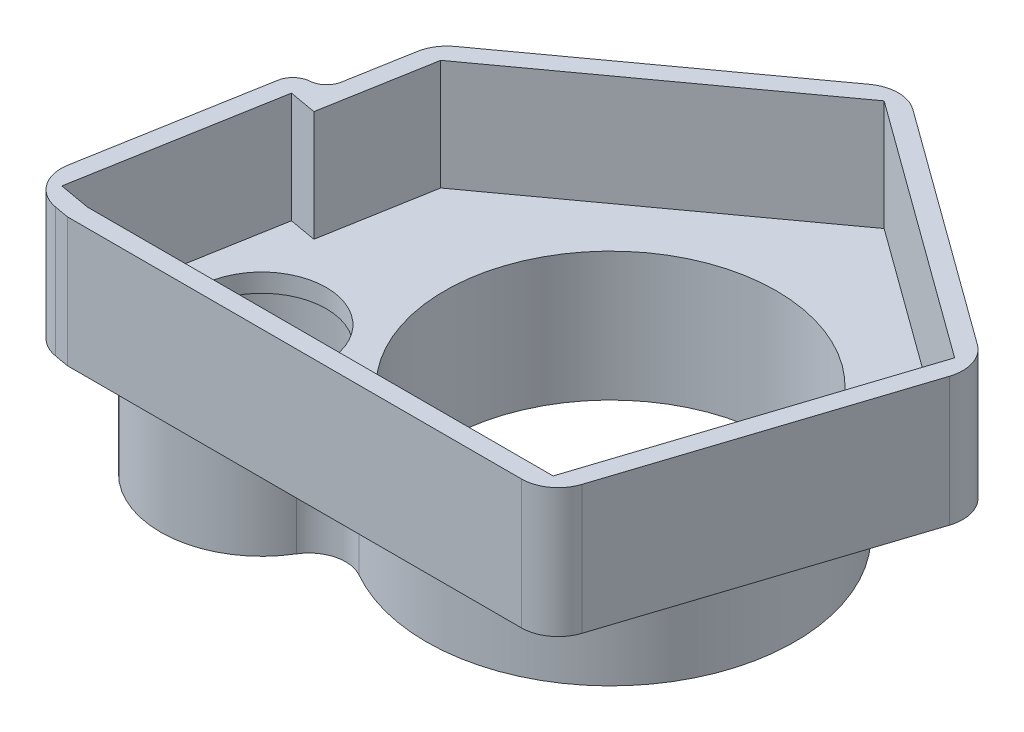
ISO-10303-21;
HEADER;
FILE_DESCRIPTION(('STEP AP214'),'2;1');
FILE_NAME('part.step','',(''),(''),'','','');
FILE_SCHEMA(('AUTOMOTIVE_DESIGN { 1 0 10303 214 1 1 1 1 }'));
ENDSEC;
DATA;
#1=APPLICATION_CONTEXT('core data for automotive mechanical design processes');
#2=APPLICATION_PROTOCOL_DEFINITION('international standard','automotive_design',2000,#1);
#3=PRODUCT_CONTEXT('',#1,'mechanical');
#4=PRODUCT('Part','Part','',(#3));
#5=PRODUCT_RELATED_PRODUCT_CATEGORY('part','',(#4));
#6=PRODUCT_DEFINITION_FORMATION('','',#4);
#7=PRODUCT_DEFINITION_CONTEXT('part definition',#1,'design');
#8=PRODUCT_DEFINITION('design','',#6,#7);
#9=PRODUCT_DEFINITION_SHAPE('','',#8);
#10=(LENGTH_UNIT() NAMED_UNIT(*) SI_UNIT(.MILLI.,.METRE.));
#11=(NAMED_UNIT(*) PLANE_ANGLE_UNIT() SI_UNIT($,.RADIAN.));
#12=(NAMED_UNIT(*) SI_UNIT($,.STERADIAN.) SOLID_ANGLE_UNIT());
#13=UNCERTAINTY_MEASURE_WITH_UNIT(LENGTH_MEASURE(1.E-05),#10,'distance_accuracy_value','');
#14=(GEOMETRIC_REPRESENTATION_CONTEXT(3) GLOBAL_UNCERTAINTY_ASSIGNED_CONTEXT((#13)) GLOBAL_UNIT_ASSIGNED_CONTEXT((#10,
#11,#12)) REPRESENTATION_CONTEXT('',''));
#15=CARTESIAN_POINT('',(0.,0.,0.));
#16=DIRECTION('',(0.,0.,1.));
#17=DIRECTION('',(1.,0.,0.));
#18=AXIS2_PLACEMENT_3D('',#15,#16,#17);
#19=CARTESIAN_POINT('',(0.,35.,-127.603100659897));
#20=DIRECTION('',(0.,-1.,0.));
#21=DIRECTION('',(0.,0.,-1.));
#22=AXIS2_PLACEMENT_3D('',#19,#20,#21);
#23=CYLINDRICAL_SURFACE('',#22,45.);
#24=CARTESIAN_POINT('',(0.,5.,-127.603100659897));
#25=DIRECTION('',(0.,1.,0.));
#26=DIRECTION('',(0.,0.,1.));
#27=AXIS2_PLACEMENT_3D('',#24,#25,#26);
#28=CIRCLE('',#27,45.);
#29=CARTESIAN_POINT('',(0.,5.,-82.6031006598971));
#30=VERTEX_POINT('',#29);
#31=EDGE_CURVE('E320',#30,#30,#28,.T.);
#32=ORIENTED_EDGE('',*,*,#31,.T.);
#33=EDGE_LOOP('',(#32));
#34=FACE_BOUND('',#33,.T.);
#35=CARTESIAN_POINT('',(0.,-30.,-127.603100659897));
#36=DIRECTION('',(0.,-1.,0.));
#37=DIRECTION('',(0.,0.,-1.));
#38=AXIS2_PLACEMENT_3D('',#35,#36,#37);
#39=CIRCLE('',#38,45.);
#40=CARTESIAN_POINT('',(0.,-30.,-172.603100659897));
#41=VERTEX_POINT('',#40);
#42=EDGE_CURVE('E951',#41,#41,#39,.T.);
#43=ORIENTED_EDGE('',*,*,#42,.T.);
#44=EDGE_LOOP('',(#43));
#45=FACE_BOUND('',#44,.T.);
#46=ADVANCED_FACE('F45',(#34,#45),#23,.F.);
#47=CARTESIAN_POINT('',(0.,35.,0.));
#48=DIRECTION('',(0.,-1.,0.));
#49=DIRECTION('',(0.,0.,-1.));
#50=AXIS2_PLACEMENT_3D('',#47,#48,#49);
#51=PLANE('',#50);
#52=DIRECTION('',(-0.809016994374946,0.,-0.587785252292476));
#53=VECTOR('',#52,1.);
#54=CARTESIAN_POINT('',(69.9420150264553,35.,-151.023320226287));
#55=LINE('',#54,#53);
#56=CARTESIAN_POINT('',(69.9420150264553,35.,-151.023320226287));
#57=VERTEX_POINT('',#56);
#58=CARTESIAN_POINT('',(0.,35.,-201.839168637397));
#59=VERTEX_POINT('',#58);
#60=EDGE_CURVE('E251',#57,#59,#55,.T.);
#61=ORIENTED_EDGE('',*,*,#60,.F.);
#62=DIRECTION('',(0.309016994374946,0.,-0.951056516295154));
#63=VECTOR('',#62,1.);
#64=CARTESIAN_POINT('',(43.2265425280054,35.,-68.8015503299486));
#65=LINE('',#64,#63);
#66=CARTESIAN_POINT('',(43.2265425280054,35.,-68.8015503299486));
#67=VERTEX_POINT('',#66);
#68=EDGE_CURVE('E247',#67,#57,#65,.T.);
#69=ORIENTED_EDGE('',*,*,#68,.F.);
#70=DIRECTION('',(1.,0.,0.));
#71=VECTOR('',#70,1.);
#72=CARTESIAN_POINT('',(-83.1081717255187,35.,-68.8015503299486));
#73=LINE('',#72,#71);
#74=CARTESIAN_POINT('',(-83.1081717255187,35.,-68.8015503299486));
#75=VERTEX_POINT('',#74);
#76=EDGE_CURVE('E262',#75,#67,#73,.T.);
#77=ORIENTED_EDGE('',*,*,#76,.F.);
#78=DIRECTION('',(0.984807753012207,0.,0.173648177666935));
#79=VECTOR('',#78,1.);
#80=CARTESIAN_POINT('',(-91.5651971402635,35.,-70.2927520871053));
#81=LINE('',#80,#79);
#82=CARTESIAN_POINT('',(-91.5651971402635,35.,-70.2927520871053));
#83=VERTEX_POINT('',#82);
#84=EDGE_CURVE('E310',#83,#75,#81,.T.);
#85=ORIENTED_EDGE('',*,*,#84,.F.);
#86=DIRECTION('',(-0.173648177666935,0.,0.984807753012207));
#87=VECTOR('',#86,1.);
#88=CARTESIAN_POINT('',(-82.2252247687976,35.,-123.26236759313));
#89=LINE('',#88,#87);
#90=CARTESIAN_POINT('',(-82.2252247687976,35.,-123.26236759313));
#91=VERTEX_POINT('',#90);
#92=EDGE_CURVE('E306',#91,#83,#89,.T.);
#93=ORIENTED_EDGE('',*,*,#92,.F.);
#94=DIRECTION('',(-0.984807753012207,0.,-0.173648177666935));
#95=VECTOR('',#94,1.);
#96=CARTESIAN_POINT('',(-74.8391666212061,35.,-121.960006260628));
#97=LINE('',#96,#95);
#98=CARTESIAN_POINT('',(-74.8391666212061,35.,-121.960006260628));
#99=VERTEX_POINT('',#98);
#100=EDGE_CURVE('E302',#99,#91,#97,.T.);
#101=ORIENTED_EDGE('',*,*,#100,.F.);
#102=DIRECTION('',(-0.173648177666935,0.,0.984807753012207));
#103=VECTOR('',#102,1.);
#104=CARTESIAN_POINT('',(-69.6810938570366,35.,-151.212890552326));
#105=LINE('',#104,#103);
#106=CARTESIAN_POINT('',(-69.6810938570366,35.,-151.212890552326));
#107=VERTEX_POINT('',#106);
#108=EDGE_CURVE('E298',#107,#99,#105,.T.);
#109=ORIENTED_EDGE('',*,*,#108,.F.);
#110=DIRECTION('',(-0.809016994374945,0.,0.587785252292476));
#111=VECTOR('',#110,1.);
#112=CARTESIAN_POINT('',(0.,35.,-201.839168637397));
#113=LINE('',#112,#111);
#114=EDGE_CURVE('E294',#59,#107,#113,.T.);
#115=ORIENTED_EDGE('',*,*,#114,.F.);
#116=EDGE_LOOP('',(#61,#69,#77,#85,#93,#101,#109,#115));
#117=FACE_BOUND('',#116,.T.);
#118=CARTESIAN_POINT('',(-82.9507623746588,35.,-133.544565567419));
#119=DIRECTION('',(0.,-1.,0.));
#120=DIRECTION('',(0.,0.,-1.));
#121=AXIS2_PLACEMENT_3D('',#118,#119,#120);
#122=CIRCLE('',#121,5.);
#123=CARTESIAN_POINT('',(-78.0267236095978,35.,-132.676324679084));
#124=VERTEX_POINT('',#123);
#125=CARTESIAN_POINT('',(-82.5604233086477,35.,-128.559825312045));
#126=VERTEX_POINT('',#125);
#127=EDGE_CURVE('E483',#124,#126,#122,.T.);
#128=ORIENTED_EDGE('',*,*,#127,.T.);
#129=CARTESIAN_POINT('',(-82.1700842426365,35.,-123.575085056671));
#130=DIRECTION('',(0.,-1.,0.));
#131=DIRECTION('',(0.,0.,-1.));
#132=AXIS2_PLACEMENT_3D('',#129,#130,#131);
#133=CIRCLE('',#132,5.);
#134=CARTESIAN_POINT('',(-87.0941230076976,35.,-124.443325945006));
#135=VERTEX_POINT('',#134);
#136=EDGE_CURVE('E11',#126,#135,#133,.F.);
#137=ORIENTED_EDGE('',*,*,#136,.T.);
#138=DIRECTION('',(-0.173648177666935,0.,0.984807753012207));
#139=VECTOR('',#138,1.);
#140=CARTESIAN_POINT('',(-97.3574767936592,35.,-66.236954210379));
#141=LINE('',#140,#139);
#142=CARTESIAN_POINT('',(-95.6209950169898,35.,-76.085031740501));
#143=VERTEX_POINT('',#142);
#144=EDGE_CURVE('E366',#135,#143,#141,.T.);
#145=ORIENTED_EDGE('',*,*,#144,.T.);
#146=CARTESIAN_POINT('',(-85.7729174868677,35.,-74.3485499638317));
#147=DIRECTION('',(0.,-1.,0.));
#148=DIRECTION('',(0.,0.,-1.));
#149=AXIS2_PLACEMENT_3D('',#146,#147,#148);
#150=CIRCLE('',#149,10.);
#151=CARTESIAN_POINT('',(-87.5093992635371,35.,-64.5004724337096));
#152=VERTEX_POINT('',#151);
#153=EDGE_CURVE('E445',#143,#152,#150,.F.);
#154=ORIENTED_EDGE('',*,*,#153,.T.);
#155=DIRECTION('',(0.984807753012207,0.,0.173648177666935));
#156=VECTOR('',#155,1.);
#157=CARTESIAN_POINT('',(-83.5456150431482,35.,-63.8015503299486));
#158=LINE('',#157,#156);
#159=CARTESIAN_POINT('',(-83.5456150431482,35.,-63.8015503299486));
#160=VERTEX_POINT('',#159);
#161=EDGE_CURVE('E342',#152,#160,#158,.T.);
#162=ORIENTED_EDGE('',*,*,#161,.T.);
#163=DIRECTION('',(1.,0.,0.));
#164=VECTOR('',#163,1.);
#165=CARTESIAN_POINT('',(46.8592551680322,35.,-63.8015503299486));
#166=LINE('',#165,#164);
#167=CARTESIAN_POINT('',(39.5938298879785,35.,-63.8015503299486));
#168=VERTEX_POINT('',#167);
#169=EDGE_CURVE('E345',#160,#168,#166,.T.);
#170=ORIENTED_EDGE('',*,*,#169,.T.);
#171=CARTESIAN_POINT('',(39.5938298879785,35.,-73.8015503299486));
#172=DIRECTION('',(0.,-1.,0.));
#173=DIRECTION('',(0.,0.,-1.));
#174=AXIS2_PLACEMENT_3D('',#171,#172,#173);
#175=CIRCLE('',#174,10.);
#176=CARTESIAN_POINT('',(49.1043950509301,35.,-70.7113803861991));
#177=VERTEX_POINT('',#176);
#178=EDGE_CURVE('E448',#168,#177,#175,.F.);
#179=ORIENTED_EDGE('',*,*,#178,.T.);
#180=DIRECTION('',(0.309016994374946,0.,-0.951056516295154));
#181=VECTOR('',#180,1.);
#182=CARTESIAN_POINT('',(75.81986754938,35.,-152.933150282537));
#183=LINE('',#182,#181);
#184=CARTESIAN_POINT('',(73.5747276664821,35.,-146.023320226287));
#185=VERTEX_POINT('',#184);
#186=EDGE_CURVE('E350',#177,#185,#183,.T.);
#187=ORIENTED_EDGE('',*,*,#186,.T.);
#188=CARTESIAN_POINT('',(64.0641625035306,35.,-149.113490170036));
#189=DIRECTION('',(0.,-1.,0.));
#190=DIRECTION('',(0.,0.,-1.));
#191=AXIS2_PLACEMENT_3D('',#188,#189,#190);
#192=CIRCLE('',#191,10.);
#193=CARTESIAN_POINT('',(69.9420150264553,35.,-157.203660113786));
#194=VERTEX_POINT('',#193);
#195=EDGE_CURVE('E436',#185,#194,#192,.F.);
#196=ORIENTED_EDGE('',*,*,#195,.T.);
#197=DIRECTION('',(-0.809016994374946,0.,-0.587785252292476));
#198=VECTOR('',#197,1.);
#199=CARTESIAN_POINT('',(0.,35.,-208.019508524896));
#200=LINE('',#199,#198);
#201=CARTESIAN_POINT('',(5.87785252292478,35.,-203.748998693647));
#202=VERTEX_POINT('',#201);
#203=EDGE_CURVE('E354',#194,#202,#200,.T.);
#204=ORIENTED_EDGE('',*,*,#203,.T.);
#205=CARTESIAN_POINT('',(0.,35.,-195.658828749898));
#206=DIRECTION('',(0.,-1.,0.));
#207=DIRECTION('',(0.,0.,-1.));
#208=AXIS2_PLACEMENT_3D('',#205,#206,#207);
#209=CIRCLE('',#208,10.);
#210=CARTESIAN_POINT('',(-5.87785252292472,35.,-203.748998693647));
#211=VERTEX_POINT('',#210);
#212=EDGE_CURVE('E439',#202,#211,#209,.F.);
#213=ORIENTED_EDGE('',*,*,#212,.T.);
#214=DIRECTION('',(-0.809016994374946,0.,0.587785252292476));
#215=VECTOR('',#214,1.);
#216=CARTESIAN_POINT('',(-74.254340532868,35.,-154.070572238775));
#217=LINE('',#216,#215);
#218=CARTESIAN_POINT('',(-70.98569970413,35.,-156.445378809628));
#219=VERTEX_POINT('',#218);
#220=EDGE_CURVE('E358',#211,#219,#217,.T.);
#221=ORIENTED_EDGE('',*,*,#220,.T.);
#222=CARTESIAN_POINT('',(-65.1078471812052,35.,-148.355208865878));
#223=DIRECTION('',(0.,-1.,0.));
#224=DIRECTION('',(0.,0.,-1.));
#225=AXIS2_PLACEMENT_3D('',#222,#223,#224);
#226=CIRCLE('',#225,10.);
#227=CARTESIAN_POINT('',(-74.9559247113273,35.,-150.091690642547));
#228=VERTEX_POINT('',#227);
#229=EDGE_CURVE('E442',#219,#228,#226,.F.);
#230=ORIENTED_EDGE('',*,*,#229,.T.);
#231=DIRECTION('',(-0.173648177666935,0.,0.984807753012207));
#232=VECTOR('',#231,1.);
#233=CARTESIAN_POINT('',(-78.8949644979324,35.,-127.752285914023));
#234=LINE('',#233,#232);
#235=EDGE_CURVE('E362',#228,#124,#234,.T.);
#236=ORIENTED_EDGE('',*,*,#235,.T.);
#237=EDGE_LOOP('',(#128,#137,#145,#154,#162,#170,#179,#187,#196,#204,#213,#221,#230,#236));
#238=FACE_BOUND('',#237,.T.);
#239=ADVANCED_FACE('F508',(#117,#238),#51,.F.);
#240=CARTESIAN_POINT('',(0.,0.,0.));
#241=DIRECTION('',(0.,-1.,0.));
#242=DIRECTION('',(0.,0.,-1.));
#243=AXIS2_PLACEMENT_3D('',#240,#241,#242);
#244=PLANE('',#243);
#245=CARTESIAN_POINT('',(-61.8532276610313,0.,-94.8284423411193));
#246=DIRECTION('',(0.,-1.,0.));
#247=DIRECTION('',(0.,0.,-1.));
#248=AXIS2_PLACEMENT_3D('',#245,#246,#247);
#249=CIRCLE('',#248,27.5);
#250=CARTESIAN_POINT('',(-38.2941352912617,0.,-80.6432681542204));
#251=VERTEX_POINT('',#250);
#252=CARTESIAN_POINT('',(-60.3607109024427,0.,-122.287910539271));
#253=VERTEX_POINT('',#252);
#254=EDGE_CURVE('E964',#251,#253,#249,.T.);
#255=ORIENTED_EDGE('',*,*,#254,.F.);
#256=CARTESIAN_POINT('',(-29.7271926113455,0.,-75.4850229953481));
#257=DIRECTION('',(0.,1.,0.));
#258=DIRECTION('',(0.,0.,1.));
#259=AXIS2_PLACEMENT_3D('',#256,#257,#258);
#260=CIRCLE('',#259,10.);
#261=CARTESIAN_POINT('',(-24.7726605094545,0.,-84.1713692727729));
#262=VERTEX_POINT('',#261);
#263=EDGE_CURVE('E244',#262,#251,#260,.T.);
#264=ORIENTED_EDGE('',*,*,#263,.F.);
#265=CARTESIAN_POINT('',(0.,0.,-127.603100659897));
#266=DIRECTION('',(0.,-1.,0.));
#267=DIRECTION('',(0.,0.,-1.));
#268=AXIS2_PLACEMENT_3D('',#265,#266,#267);
#269=CIRCLE('',#268,50.);
#270=CARTESIAN_POINT('',(-49.8483146130694,0.,-131.494826528513));
#271=VERTEX_POINT('',#270);
#272=EDGE_CURVE('E240',#271,#262,#269,.T.);
#273=ORIENTED_EDGE('',*,*,#272,.F.);
#274=CARTESIAN_POINT('',(-59.8179775356833,0.,-132.273171702236));
#275=DIRECTION('',(0.,1.,0.));
#276=DIRECTION('',(0.,0.,-1.));
#277=AXIS2_PLACEMENT_3D('',#274,#275,#276);
#278=CIRCLE('',#277,10.);
#279=EDGE_CURVE('E967',#253,#271,#278,.T.);
#280=ORIENTED_EDGE('',*,*,#279,.F.);
#281=EDGE_LOOP('',(#255,#264,#273,#280));
#282=FACE_BOUND('',#281,.T.);
#283=DIRECTION('',(-0.173648177666935,0.,0.984807753012207));
#284=VECTOR('',#283,1.);
#285=CARTESIAN_POINT('',(-97.3574767936592,0.,-66.236954210379));
#286=LINE('',#285,#284);
#287=CARTESIAN_POINT('',(-87.0941230076976,0.,-124.443325945006));
#288=VERTEX_POINT('',#287);
#289=CARTESIAN_POINT('',(-95.6209950169898,0.,-76.085031740501));
#290=VERTEX_POINT('',#289);
#291=EDGE_CURVE('E346',#288,#290,#286,.T.);
#292=ORIENTED_EDGE('',*,*,#291,.F.);
#293=CARTESIAN_POINT('',(-82.1700842426365,0.,-123.575085056671));
#294=DIRECTION('',(0.,-1.,0.));
#295=DIRECTION('',(0.,0.,-1.));
#296=AXIS2_PLACEMENT_3D('',#293,#294,#295);
#297=CIRCLE('',#296,5.);
#298=CARTESIAN_POINT('',(-82.5604233086477,0.,-128.559825312045));
#299=VERTEX_POINT('',#298);
#300=EDGE_CURVE('E68',#288,#299,#297,.T.);
#301=ORIENTED_EDGE('',*,*,#300,.T.);
#302=CARTESIAN_POINT('',(-82.9507623746588,0.,-133.544565567419));
#303=DIRECTION('',(0.,-1.,0.));
#304=DIRECTION('',(0.,0.,-1.));
#305=AXIS2_PLACEMENT_3D('',#302,#303,#304);
#306=CIRCLE('',#305,5.);
#307=CARTESIAN_POINT('',(-78.0267236095978,0.,-132.676324679084));
#308=VERTEX_POINT('',#307);
#309=EDGE_CURVE('E480',#299,#308,#306,.F.);
#310=ORIENTED_EDGE('',*,*,#309,.T.);
#311=DIRECTION('',(-0.173648177666935,0.,0.984807753012207));
#312=VECTOR('',#311,1.);
#313=CARTESIAN_POINT('',(-78.8949644979324,0.,-127.752285914023));
#314=LINE('',#313,#312);
#315=CARTESIAN_POINT('',(-74.9559247113273,0.,-150.091690642547));
#316=VERTEX_POINT('',#315);
#317=EDGE_CURVE('E389',#316,#308,#314,.T.);
#318=ORIENTED_EDGE('',*,*,#317,.F.);
#319=CARTESIAN_POINT('',(-65.1078471812052,0.,-148.355208865878));
#320=DIRECTION('',(0.,-1.,0.));
#321=DIRECTION('',(0.,0.,-1.));
#322=AXIS2_PLACEMENT_3D('',#319,#320,#321);
#323=CIRCLE('',#322,10.);
#324=CARTESIAN_POINT('',(-70.98569970413,0.,-156.445378809628));
#325=VERTEX_POINT('',#324);
#326=EDGE_CURVE('E423',#316,#325,#323,.T.);
#327=ORIENTED_EDGE('',*,*,#326,.T.);
#328=DIRECTION('',(-0.809016994374946,0.,0.587785252292476));
#329=VECTOR('',#328,1.);
#330=CARTESIAN_POINT('',(-74.254340532868,0.,-154.070572238775));
#331=LINE('',#330,#329);
#332=CARTESIAN_POINT('',(-5.87785252292472,0.,-203.748998693647));
#333=VERTEX_POINT('',#332);
#334=EDGE_CURVE('E385',#333,#325,#331,.T.);
#335=ORIENTED_EDGE('',*,*,#334,.F.);
#336=CARTESIAN_POINT('',(0.,0.,-195.658828749898));
#337=DIRECTION('',(0.,-1.,0.));
#338=DIRECTION('',(0.,0.,-1.));
#339=AXIS2_PLACEMENT_3D('',#336,#337,#338);
#340=CIRCLE('',#339,10.);
#341=CARTESIAN_POINT('',(5.87785252292478,0.,-203.748998693647));
#342=VERTEX_POINT('',#341);
#343=EDGE_CURVE('E420',#333,#342,#340,.T.);
#344=ORIENTED_EDGE('',*,*,#343,.T.);
#345=DIRECTION('',(-0.809016994374946,0.,-0.587785252292476));
#346=VECTOR('',#345,1.);
#347=CARTESIAN_POINT('',(0.,0.,-208.019508524896));
#348=LINE('',#347,#346);
#349=CARTESIAN_POINT('',(69.9420150264553,0.,-157.203660113786));
#350=VERTEX_POINT('',#349);
#351=EDGE_CURVE('E381',#350,#342,#348,.T.);
#352=ORIENTED_EDGE('',*,*,#351,.F.);
#353=CARTESIAN_POINT('',(64.0641625035306,0.,-149.113490170036));
#354=DIRECTION('',(0.,-1.,0.));
#355=DIRECTION('',(0.,0.,-1.));
#356=AXIS2_PLACEMENT_3D('',#353,#354,#355);
#357=CIRCLE('',#356,10.);
#358=CARTESIAN_POINT('',(73.5747276664821,0.,-146.023320226287));
#359=VERTEX_POINT('',#358);
#360=EDGE_CURVE('E417',#350,#359,#357,.T.);
#361=ORIENTED_EDGE('',*,*,#360,.T.);
#362=DIRECTION('',(0.309016994374946,0.,-0.951056516295154));
#363=VECTOR('',#362,1.);
#364=CARTESIAN_POINT('',(75.81986754938,0.,-152.933150282537));
#365=LINE('',#364,#363);
#366=CARTESIAN_POINT('',(49.1043950509301,0.,-70.7113803861991));
#367=VERTEX_POINT('',#366);
#368=EDGE_CURVE('E377',#367,#359,#365,.T.);
#369=ORIENTED_EDGE('',*,*,#368,.F.);
#370=CARTESIAN_POINT('',(39.5938298879785,0.,-73.8015503299486));
#371=DIRECTION('',(0.,-1.,0.));
#372=DIRECTION('',(0.,0.,-1.));
#373=AXIS2_PLACEMENT_3D('',#370,#371,#372);
#374=CIRCLE('',#373,10.);
#375=CARTESIAN_POINT('',(39.5938298879785,0.,-63.8015503299486));
#376=VERTEX_POINT('',#375);
#377=EDGE_CURVE('E430',#367,#376,#374,.T.);
#378=ORIENTED_EDGE('',*,*,#377,.T.);
#379=DIRECTION('',(1.,0.,0.));
#380=VECTOR('',#379,1.);
#381=CARTESIAN_POINT('',(46.8592551680322,0.,-63.8015503299486));
#382=LINE('',#381,#380);
#383=CARTESIAN_POINT('',(-83.5456150431482,0.,-63.8015503299486));
#384=VERTEX_POINT('',#383);
#385=EDGE_CURVE('E373',#384,#376,#382,.T.);
#386=ORIENTED_EDGE('',*,*,#385,.F.);
#387=DIRECTION('',(0.984807753012207,0.,0.173648177666935));
#388=VECTOR('',#387,1.);
#389=CARTESIAN_POINT('',(-83.5456150431482,0.,-63.8015503299486));
#390=LINE('',#389,#388);
#391=CARTESIAN_POINT('',(-87.5093992635371,0.,-64.5004724337096));
#392=VERTEX_POINT('',#391);
#393=EDGE_CURVE('E370',#392,#384,#390,.T.);
#394=ORIENTED_EDGE('',*,*,#393,.F.);
#395=CARTESIAN_POINT('',(-85.7729174868677,0.,-74.3485499638317));
#396=DIRECTION('',(0.,-1.,0.));
#397=DIRECTION('',(0.,0.,-1.));
#398=AXIS2_PLACEMENT_3D('',#395,#396,#397);
#399=CIRCLE('',#398,10.);
#400=EDGE_CURVE('E426',#392,#290,#399,.T.);
#401=ORIENTED_EDGE('',*,*,#400,.T.);
#402=EDGE_LOOP('',(#292,#301,#310,#318,#327,#335,#344,#352,#361,#369,#378,#386,#394,#401));
#403=FACE_BOUND('',#402,.T.);
#404=ADVANCED_FACE('F498',(#282,#403),#244,.T.);
#405=CARTESIAN_POINT('',(-83.5456150431482,35.,-63.8015503299486));
#406=DIRECTION('',(0.173648177666935,0.,-0.984807753012207));
#407=DIRECTION('',(-0.984807753012207,0.,-0.173648177666935));
#408=AXIS2_PLACEMENT_3D('',#405,#406,#407);
#409=PLANE('',#408);
#410=ORIENTED_EDGE('',*,*,#161,.F.);
#411=DIRECTION('',(0.,-1.,0.));
#412=VECTOR('',#411,1.);
#413=CARTESIAN_POINT('',(-87.5093992635371,35.,-64.5004724337096));
#414=LINE('',#413,#412);
#415=EDGE_CURVE('E451',#152,#392,#414,.T.);
#416=ORIENTED_EDGE('',*,*,#415,.T.);
#417=ORIENTED_EDGE('',*,*,#393,.T.);
#418=DIRECTION('',(0.,-1.,0.));
#419=VECTOR('',#418,1.);
#420=CARTESIAN_POINT('',(-83.5456150431482,35.,-63.8015503299486));
#421=LINE('',#420,#419);
#422=EDGE_CURVE('E369',#160,#384,#421,.T.);
#423=ORIENTED_EDGE('',*,*,#422,.F.);
#424=EDGE_LOOP('',(#410,#416,#417,#423));
#425=FACE_BOUND('',#424,.T.);
#426=ADVANCED_FACE('F512',(#425),#409,.F.);
#427=CARTESIAN_POINT('',(46.8592551680322,35.,-63.8015503299486));
#428=DIRECTION('',(0.,0.,-1.));
#429=DIRECTION('',(-1.,0.,0.));
#430=AXIS2_PLACEMENT_3D('',#427,#428,#429);
#431=PLANE('',#430);
#432=ORIENTED_EDGE('',*,*,#385,.T.);
#433=DIRECTION('',(0.,-1.,0.));
#434=VECTOR('',#433,1.);
#435=CARTESIAN_POINT('',(39.5938298879785,35.,-63.8015503299486));
#436=LINE('',#435,#434);
#437=EDGE_CURVE('E433',#376,#168,#436,.F.);
#438=ORIENTED_EDGE('',*,*,#437,.T.);
#439=ORIENTED_EDGE('',*,*,#169,.F.);
#440=ORIENTED_EDGE('',*,*,#422,.T.);
#441=EDGE_LOOP('',(#432,#438,#439,#440));
#442=FACE_BOUND('',#441,.T.);
#443=ADVANCED_FACE('F514',(#442),#431,.F.);
#444=CARTESIAN_POINT('',(75.81986754938,35.,-152.933150282537));
#445=DIRECTION('',(-0.951056516295154,0.,-0.309016994374946));
#446=DIRECTION('',(-0.309016994374946,0.,0.951056516295154));
#447=AXIS2_PLACEMENT_3D('',#444,#445,#446);
#448=PLANE('',#447);
#449=ORIENTED_EDGE('',*,*,#186,.F.);
#450=DIRECTION('',(0.,-1.,0.));
#451=VECTOR('',#450,1.);
#452=CARTESIAN_POINT('',(49.1043950509301,35.,-70.7113803861991));
#453=LINE('',#452,#451);
#454=EDGE_CURVE('E413',#177,#367,#453,.T.);
#455=ORIENTED_EDGE('',*,*,#454,.T.);
#456=ORIENTED_EDGE('',*,*,#368,.T.);
#457=DIRECTION('',(0.,-1.,0.));
#458=VECTOR('',#457,1.);
#459=CARTESIAN_POINT('',(73.5747276664821,35.,-146.023320226287));
#460=LINE('',#459,#458);
#461=EDGE_CURVE('E405',#359,#185,#460,.F.);
#462=ORIENTED_EDGE('',*,*,#461,.T.);
#463=EDGE_LOOP('',(#449,#455,#456,#462));
#464=FACE_BOUND('',#463,.T.);
#465=ADVANCED_FACE('F523',(#464),#448,.F.);
#466=CARTESIAN_POINT('',(0.,35.,-208.019508524896));
#467=DIRECTION('',(-0.587785252292476,0.,0.809016994374946));
#468=DIRECTION('',(0.809016994374946,0.,0.587785252292476));
#469=AXIS2_PLACEMENT_3D('',#466,#467,#468);
#470=PLANE('',#469);
#471=ORIENTED_EDGE('',*,*,#351,.T.);
#472=DIRECTION('',(0.,-1.,0.));
#473=VECTOR('',#472,1.);
#474=CARTESIAN_POINT('',(5.87785252292478,35.,-203.748998693647));
#475=LINE('',#474,#473);
#476=EDGE_CURVE('E474',#342,#202,#475,.F.);
#477=ORIENTED_EDGE('',*,*,#476,.T.);
#478=ORIENTED_EDGE('',*,*,#203,.F.);
#479=DIRECTION('',(0.,-1.,0.));
#480=VECTOR('',#479,1.);
#481=CARTESIAN_POINT('',(69.9420150264554,35.,-157.203660113786));
#482=LINE('',#481,#480);
#483=EDGE_CURVE('E470',#194,#350,#482,.T.);
#484=ORIENTED_EDGE('',*,*,#483,.T.);
#485=EDGE_LOOP('',(#471,#477,#478,#484));
#486=FACE_BOUND('',#485,.T.);
#487=ADVANCED_FACE('F532',(#486),#470,.F.);
#488=CARTESIAN_POINT('',(-74.254340532868,35.,-154.070572238775));
#489=DIRECTION('',(0.587785252292476,0.,0.809016994374946));
#490=DIRECTION('',(0.809016994374946,0.,-0.587785252292476));
#491=AXIS2_PLACEMENT_3D('',#488,#489,#490);
#492=PLANE('',#491);
#493=ORIENTED_EDGE('',*,*,#334,.T.);
#494=DIRECTION('',(0.,-1.,0.));
#495=VECTOR('',#494,1.);
#496=CARTESIAN_POINT('',(-70.98569970413,35.,-156.445378809628));
#497=LINE('',#496,#495);
#498=EDGE_CURVE('E467',#325,#219,#497,.F.);
#499=ORIENTED_EDGE('',*,*,#498,.T.);
#500=ORIENTED_EDGE('',*,*,#220,.F.);
#501=DIRECTION('',(0.,-1.,0.));
#502=VECTOR('',#501,1.);
#503=CARTESIAN_POINT('',(-5.87785252292471,35.,-203.748998693647));
#504=LINE('',#503,#502);
#505=EDGE_CURVE('E463',#211,#333,#504,.T.);
#506=ORIENTED_EDGE('',*,*,#505,.T.);
#507=EDGE_LOOP('',(#493,#499,#500,#506));
#508=FACE_BOUND('',#507,.T.);
#509=ADVANCED_FACE('F541',(#508),#492,.F.);
#510=CARTESIAN_POINT('',(-78.8949644979324,35.,-127.752285914023));
#511=DIRECTION('',(0.984807753012207,0.,0.173648177666935));
#512=DIRECTION('',(0.173648177666935,0.,-0.984807753012207));
#513=AXIS2_PLACEMENT_3D('',#510,#511,#512);
#514=PLANE('',#513);
#515=ORIENTED_EDGE('',*,*,#317,.T.);
#516=DIRECTION('',(0.,-1.,0.));
#517=VECTOR('',#516,1.);
#518=CARTESIAN_POINT('',(-78.0267236095978,35.,-132.676324679084));
#519=LINE('',#518,#517);
#520=EDGE_CURVE('E477',#308,#124,#519,.F.);
#521=ORIENTED_EDGE('',*,*,#520,.T.);
#522=ORIENTED_EDGE('',*,*,#235,.F.);
#523=DIRECTION('',(0.,-1.,0.));
#524=VECTOR('',#523,1.);
#525=CARTESIAN_POINT('',(-74.9559247113273,35.,-150.091690642547));
#526=LINE('',#525,#524);
#527=EDGE_CURVE('E459',#228,#316,#526,.T.);
#528=ORIENTED_EDGE('',*,*,#527,.T.);
#529=EDGE_LOOP('',(#515,#521,#522,#528));
#530=FACE_BOUND('',#529,.T.);
#531=ADVANCED_FACE('F550',(#530),#514,.F.);
#532=CARTESIAN_POINT('',(-97.3574767936592,35.,-66.236954210379));
#533=DIRECTION('',(0.984807753012207,0.,0.173648177666935));
#534=DIRECTION('',(0.173648177666935,0.,-0.984807753012207));
#535=AXIS2_PLACEMENT_3D('',#532,#533,#534);
#536=PLANE('',#535);
#537=ORIENTED_EDGE('',*,*,#144,.F.);
#538=DIRECTION('',(0.,1.,0.));
#539=VECTOR('',#538,1.);
#540=CARTESIAN_POINT('',(-87.0941230076976,35.,-124.443325945006));
#541=LINE('',#540,#539);
#542=EDGE_CURVE('E486',#135,#288,#541,.F.);
#543=ORIENTED_EDGE('',*,*,#542,.T.);
#544=ORIENTED_EDGE('',*,*,#291,.T.);
#545=DIRECTION('',(0.,-1.,0.));
#546=VECTOR('',#545,1.);
#547=CARTESIAN_POINT('',(-95.6209950169898,35.,-76.085031740501));
#548=LINE('',#547,#546);
#549=EDGE_CURVE('E455',#290,#143,#548,.F.);
#550=ORIENTED_EDGE('',*,*,#549,.T.);
#551=EDGE_LOOP('',(#537,#543,#544,#550));
#552=FACE_BOUND('',#551,.T.);
#553=ADVANCED_FACE('F495',(#552),#536,.F.);
#554=CARTESIAN_POINT('',(43.2265425280054,5.,-68.8015503299486));
#555=DIRECTION('',(0.951056516295154,0.,0.309016994374946));
#556=DIRECTION('',(0.309016994374946,0.,-0.951056516295154));
#557=AXIS2_PLACEMENT_3D('',#554,#555,#556);
#558=PLANE('',#557);
#559=ORIENTED_EDGE('',*,*,#68,.T.);
#560=DIRECTION('',(0.,1.,0.));
#561=VECTOR('',#560,1.);
#562=CARTESIAN_POINT('',(69.9420150264553,5.,-151.023320226287));
#563=LINE('',#562,#561);
#564=CARTESIAN_POINT('',(69.9420150264553,5.,-151.023320226287));
#565=VERTEX_POINT('',#564);
#566=EDGE_CURVE('E289',#565,#57,#563,.T.);
#567=ORIENTED_EDGE('',*,*,#566,.F.);
#568=DIRECTION('',(0.309016994374946,0.,-0.951056516295154));
#569=VECTOR('',#568,1.);
#570=CARTESIAN_POINT('',(43.2265425280054,5.,-68.8015503299486));
#571=LINE('',#570,#569);
#572=CARTESIAN_POINT('',(43.2265425280054,5.,-68.8015503299486));
#573=VERTEX_POINT('',#572);
#574=EDGE_CURVE('E257',#573,#565,#571,.T.);
#575=ORIENTED_EDGE('',*,*,#574,.F.);
#576=DIRECTION('',(0.,1.,0.));
#577=VECTOR('',#576,1.);
#578=CARTESIAN_POINT('',(43.2265425280054,5.,-68.8015503299486));
#579=LINE('',#578,#577);
#580=EDGE_CURVE('E317',#573,#67,#579,.T.);
#581=ORIENTED_EDGE('',*,*,#580,.T.);
#582=EDGE_LOOP('',(#559,#567,#575,#581));
#583=FACE_BOUND('',#582,.T.);
#584=ADVANCED_FACE('F567',(#583),#558,.F.);
#585=CARTESIAN_POINT('',(-83.1081717255187,5.,-68.8015503299486));
#586=DIRECTION('',(0.,0.,1.));
#587=DIRECTION('',(1.,0.,0.));
#588=AXIS2_PLACEMENT_3D('',#585,#586,#587);
#589=PLANE('',#588);
#590=ORIENTED_EDGE('',*,*,#76,.T.);
#591=ORIENTED_EDGE('',*,*,#580,.F.);
#592=DIRECTION('',(1.,0.,0.));
#593=VECTOR('',#592,1.);
#594=CARTESIAN_POINT('',(-83.1081717255187,5.,-68.8015503299486));
#595=LINE('',#594,#593);
#596=CARTESIAN_POINT('',(-83.1081717255187,5.,-68.8015503299486));
#597=VERTEX_POINT('',#596);
#598=EDGE_CURVE('E286',#597,#573,#595,.T.);
#599=ORIENTED_EDGE('',*,*,#598,.F.);
#600=DIRECTION('',(0.,1.,0.));
#601=VECTOR('',#600,1.);
#602=CARTESIAN_POINT('',(-83.1081717255187,5.,-68.8015503299486));
#603=LINE('',#602,#601);
#604=EDGE_CURVE('E321',#597,#75,#603,.T.);
#605=ORIENTED_EDGE('',*,*,#604,.T.);
#606=EDGE_LOOP('',(#590,#591,#599,#605));
#607=FACE_BOUND('',#606,.T.);
#608=ADVANCED_FACE('F788',(#607),#589,.F.);
#609=CARTESIAN_POINT('',(-91.5651971402635,5.,-70.2927520871053));
#610=DIRECTION('',(-0.173648177666935,0.,0.984807753012207));
#611=DIRECTION('',(0.984807753012207,0.,0.173648177666935));
#612=AXIS2_PLACEMENT_3D('',#609,#610,#611);
#613=PLANE('',#612);
#614=ORIENTED_EDGE('',*,*,#84,.T.);
#615=ORIENTED_EDGE('',*,*,#604,.F.);
#616=DIRECTION('',(0.984807753012207,0.,0.173648177666935));
#617=VECTOR('',#616,1.);
#618=CARTESIAN_POINT('',(-91.5651971402635,5.,-70.2927520871053));
#619=LINE('',#618,#617);
#620=CARTESIAN_POINT('',(-91.5651971402635,5.,-70.2927520871053));
#621=VERTEX_POINT('',#620);
#622=EDGE_CURVE('E282',#621,#597,#619,.T.);
#623=ORIENTED_EDGE('',*,*,#622,.F.);
#624=DIRECTION('',(0.,1.,0.));
#625=VECTOR('',#624,1.);
#626=CARTESIAN_POINT('',(-91.5651971402635,5.,-70.2927520871053));
#627=LINE('',#626,#625);
#628=EDGE_CURVE('E324',#621,#83,#627,.T.);
#629=ORIENTED_EDGE('',*,*,#628,.T.);
#630=EDGE_LOOP('',(#614,#615,#623,#629));
#631=FACE_BOUND('',#630,.T.);
#632=ADVANCED_FACE('F778',(#631),#613,.F.);
#633=CARTESIAN_POINT('',(-82.2252247687976,5.,-123.26236759313));
#634=DIRECTION('',(-0.984807753012207,0.,-0.173648177666935));
#635=DIRECTION('',(-0.173648177666935,0.,0.984807753012207));
#636=AXIS2_PLACEMENT_3D('',#633,#634,#635);
#637=PLANE('',#636);
#638=ORIENTED_EDGE('',*,*,#92,.T.);
#639=ORIENTED_EDGE('',*,*,#628,.F.);
#640=DIRECTION('',(-0.173648177666935,0.,0.984807753012207));
#641=VECTOR('',#640,1.);
#642=CARTESIAN_POINT('',(-82.2252247687976,5.,-123.26236759313));
#643=LINE('',#642,#641);
#644=CARTESIAN_POINT('',(-82.2252247687976,5.,-123.26236759313));
#645=VERTEX_POINT('',#644);
#646=EDGE_CURVE('E278',#645,#621,#643,.T.);
#647=ORIENTED_EDGE('',*,*,#646,.F.);
#648=DIRECTION('',(0.,1.,0.));
#649=VECTOR('',#648,1.);
#650=CARTESIAN_POINT('',(-82.2252247687976,5.,-123.26236759313));
#651=LINE('',#650,#649);
#652=EDGE_CURVE('E327',#645,#91,#651,.T.);
#653=ORIENTED_EDGE('',*,*,#652,.T.);
#654=EDGE_LOOP('',(#638,#639,#647,#653));
#655=FACE_BOUND('',#654,.T.);
#656=ADVANCED_FACE('F768',(#655),#637,.F.);
#657=CARTESIAN_POINT('',(-74.8391666212061,5.,-121.960006260628));
#658=DIRECTION('',(0.173648177666935,0.,-0.984807753012207));
#659=DIRECTION('',(-0.984807753012207,0.,-0.173648177666935));
#660=AXIS2_PLACEMENT_3D('',#657,#658,#659);
#661=PLANE('',#660);
#662=ORIENTED_EDGE('',*,*,#100,.T.);
#663=ORIENTED_EDGE('',*,*,#652,.F.);
#664=DIRECTION('',(-0.984807753012207,0.,-0.173648177666935));
#665=VECTOR('',#664,1.);
#666=CARTESIAN_POINT('',(-74.8391666212061,5.,-121.960006260628));
#667=LINE('',#666,#665);
#668=CARTESIAN_POINT('',(-74.8391666212061,5.,-121.960006260628));
#669=VERTEX_POINT('',#668);
#670=EDGE_CURVE('E274',#669,#645,#667,.T.);
#671=ORIENTED_EDGE('',*,*,#670,.F.);
#672=DIRECTION('',(0.,1.,0.));
#673=VECTOR('',#672,1.);
#674=CARTESIAN_POINT('',(-74.8391666212061,5.,-121.960006260628));
#675=LINE('',#674,#673);
#676=EDGE_CURVE('E330',#669,#99,#675,.T.);
#677=ORIENTED_EDGE('',*,*,#676,.T.);
#678=EDGE_LOOP('',(#662,#663,#671,#677));
#679=FACE_BOUND('',#678,.T.);
#680=ADVANCED_FACE('F758',(#679),#661,.F.);
#681=CARTESIAN_POINT('',(-69.6810938570366,5.,-151.212890552326));
#682=DIRECTION('',(-0.984807753012207,0.,-0.173648177666935));
#683=DIRECTION('',(-0.173648177666935,0.,0.984807753012207));
#684=AXIS2_PLACEMENT_3D('',#681,#682,#683);
#685=PLANE('',#684);
#686=ORIENTED_EDGE('',*,*,#108,.T.);
#687=ORIENTED_EDGE('',*,*,#676,.F.);
#688=DIRECTION('',(-0.173648177666935,0.,0.984807753012207));
#689=VECTOR('',#688,1.);
#690=CARTESIAN_POINT('',(-69.6810938570366,5.,-151.212890552326));
#691=LINE('',#690,#689);
#692=CARTESIAN_POINT('',(-69.6810938570366,5.,-151.212890552326));
#693=VERTEX_POINT('',#692);
#694=EDGE_CURVE('E270',#693,#669,#691,.T.);
#695=ORIENTED_EDGE('',*,*,#694,.F.);
#696=DIRECTION('',(0.,1.,0.));
#697=VECTOR('',#696,1.);
#698=CARTESIAN_POINT('',(-69.6810938570366,5.,-151.212890552326));
#699=LINE('',#698,#697);
#700=EDGE_CURVE('E333',#693,#107,#699,.T.);
#701=ORIENTED_EDGE('',*,*,#700,.T.);
#702=EDGE_LOOP('',(#686,#687,#695,#701));
#703=FACE_BOUND('',#702,.T.);
#704=ADVANCED_FACE('F748',(#703),#685,.F.);
#705=CARTESIAN_POINT('',(0.,5.,-201.839168637397));
#706=DIRECTION('',(-0.587785252292476,0.,-0.809016994374946));
#707=DIRECTION('',(-0.809016994374946,0.,0.587785252292476));
#708=AXIS2_PLACEMENT_3D('',#705,#706,#707);
#709=PLANE('',#708);
#710=ORIENTED_EDGE('',*,*,#114,.T.);
#711=ORIENTED_EDGE('',*,*,#700,.F.);
#712=DIRECTION('',(-0.809016994374945,0.,0.587785252292476));
#713=VECTOR('',#712,1.);
#714=CARTESIAN_POINT('',(0.,5.,-201.839168637397));
#715=LINE('',#714,#713);
#716=CARTESIAN_POINT('',(0.,5.,-201.839168637397));
#717=VERTEX_POINT('',#716);
#718=EDGE_CURVE('E266',#717,#693,#715,.T.);
#719=ORIENTED_EDGE('',*,*,#718,.F.);
#720=DIRECTION('',(0.,1.,0.));
#721=VECTOR('',#720,1.);
#722=CARTESIAN_POINT('',(0.,5.,-201.839168637397));
#723=LINE('',#722,#721);
#724=EDGE_CURVE('E336',#717,#59,#723,.T.);
#725=ORIENTED_EDGE('',*,*,#724,.T.);
#726=EDGE_LOOP('',(#710,#711,#719,#725));
#727=FACE_BOUND('',#726,.T.);
#728=ADVANCED_FACE('F739',(#727),#709,.F.);
#729=CARTESIAN_POINT('',(69.9420150264553,5.,-151.023320226287));
#730=DIRECTION('',(0.587785252292476,0.,-0.809016994374946));
#731=DIRECTION('',(-0.809016994374946,0.,-0.587785252292476));
#732=AXIS2_PLACEMENT_3D('',#729,#730,#731);
#733=PLANE('',#732);
#734=ORIENTED_EDGE('',*,*,#60,.T.);
#735=ORIENTED_EDGE('',*,*,#724,.F.);
#736=DIRECTION('',(-0.809016994374946,0.,-0.587785252292476));
#737=VECTOR('',#736,1.);
#738=CARTESIAN_POINT('',(69.9420150264553,5.,-151.023320226287));
#739=LINE('',#738,#737);
#740=EDGE_CURVE('E261',#565,#717,#739,.T.);
#741=ORIENTED_EDGE('',*,*,#740,.F.);
#742=ORIENTED_EDGE('',*,*,#566,.T.);
#743=EDGE_LOOP('',(#734,#735,#741,#742));
#744=FACE_BOUND('',#743,.T.);
#745=ADVANCED_FACE('F730',(#744),#733,.F.);
#746=CARTESIAN_POINT('',(0.,5.,0.));
#747=DIRECTION('',(0.,1.,0.));
#748=DIRECTION('',(0.,0.,1.));
#749=AXIS2_PLACEMENT_3D('',#746,#747,#748);
#750=PLANE('',#749);
#751=CARTESIAN_POINT('',(-61.8532276610313,5.,-94.8284423411193));
#752=DIRECTION('',(0.,1.,0.));
#753=DIRECTION('',(0.,0.,1.));
#754=AXIS2_PLACEMENT_3D('',#751,#752,#753);
#755=CIRCLE('',#754,17.5);
#756=CARTESIAN_POINT('',(-61.8532276610313,5.,-77.3284423411193));
#757=VERTEX_POINT('',#756);
#758=EDGE_CURVE('E410',#757,#757,#755,.T.);
#759=ORIENTED_EDGE('',*,*,#758,.F.);
#760=EDGE_LOOP('',(#759));
#761=FACE_BOUND('',#760,.T.);
#762=ORIENTED_EDGE('',*,*,#31,.F.);
#763=EDGE_LOOP('',(#762));
#764=FACE_BOUND('',#763,.T.);
#765=ORIENTED_EDGE('',*,*,#574,.T.);
#766=ORIENTED_EDGE('',*,*,#740,.T.);
#767=ORIENTED_EDGE('',*,*,#718,.T.);
#768=ORIENTED_EDGE('',*,*,#694,.T.);
#769=ORIENTED_EDGE('',*,*,#670,.T.);
#770=ORIENTED_EDGE('',*,*,#646,.T.);
#771=ORIENTED_EDGE('',*,*,#622,.T.);
#772=ORIENTED_EDGE('',*,*,#598,.T.);
#773=EDGE_LOOP('',(#765,#766,#767,#768,#769,#770,#771,#772));
#774=FACE_BOUND('',#773,.T.);
#775=ADVANCED_FACE('F710',(#761,#764,#774),#750,.T.);
#776=CARTESIAN_POINT('',(-45.7902101361884,-30.,-85.1567326682337));
#777=DIRECTION('',(0.,1.,0.));
#778=DIRECTION('',(0.,0.,1.));
#779=AXIS2_PLACEMENT_3D('',#776,#777,#778);
#780=PLANE('',#779);
#781=CARTESIAN_POINT('',(-29.7271926113455,-30.,-75.4850229953481));
#782=DIRECTION('',(0.,1.,0.));
#783=DIRECTION('',(0.,0.,1.));
#784=AXIS2_PLACEMENT_3D('',#781,#782,#783);
#785=CIRCLE('',#784,10.);
#786=CARTESIAN_POINT('',(-24.7726605094545,-30.,-84.1713692727729));
#787=VERTEX_POINT('',#786);
#788=CARTESIAN_POINT('',(-38.2941352912617,-30.,-80.6432681542204));
#789=VERTEX_POINT('',#788);
#790=EDGE_CURVE('E229',#787,#789,#785,.T.);
#791=ORIENTED_EDGE('',*,*,#790,.T.);
#792=CARTESIAN_POINT('',(-61.8532276610313,-30.,-94.8284423411193));
#793=DIRECTION('',(0.,-1.,0.));
#794=DIRECTION('',(0.,0.,-1.));
#795=AXIS2_PLACEMENT_3D('',#792,#793,#794);
#796=CIRCLE('',#795,27.5);
#797=CARTESIAN_POINT('',(-60.3607109024427,-30.,-122.287910539271));
#798=VERTEX_POINT('',#797);
#799=EDGE_CURVE('E217',#789,#798,#796,.T.);
#800=ORIENTED_EDGE('',*,*,#799,.T.);
#801=CARTESIAN_POINT('',(-59.8179775356833,-30.,-132.273171702236));
#802=DIRECTION('',(0.,1.,0.));
#803=DIRECTION('',(0.,0.,-1.));
#804=AXIS2_PLACEMENT_3D('',#801,#802,#803);
#805=CIRCLE('',#804,10.);
#806=CARTESIAN_POINT('',(-49.8483146130694,-30.,-131.494826528513));
#807=VERTEX_POINT('',#806);
#808=EDGE_CURVE('E228',#798,#807,#805,.T.);
#809=ORIENTED_EDGE('',*,*,#808,.T.);
#810=CARTESIAN_POINT('',(0.,-30.,-127.603100659897));
#811=DIRECTION('',(0.,-1.,0.));
#812=DIRECTION('',(0.,0.,-1.));
#813=AXIS2_PLACEMENT_3D('',#810,#811,#812);
#814=CIRCLE('',#813,50.);
#815=EDGE_CURVE('E235',#807,#787,#814,.T.);
#816=ORIENTED_EDGE('',*,*,#815,.T.);
#817=EDGE_LOOP('',(#791,#800,#809,#816));
#818=FACE_BOUND('',#817,.T.);
#819=ORIENTED_EDGE('',*,*,#42,.F.);
#820=EDGE_LOOP('',(#819));
#821=FACE_BOUND('',#820,.T.);
#822=CARTESIAN_POINT('',(-61.8532276610313,-30.,-94.8284423411193));
#823=DIRECTION('',(0.,-1.,0.));
#824=DIRECTION('',(0.,0.,-1.));
#825=AXIS2_PLACEMENT_3D('',#822,#823,#824);
#826=CIRCLE('',#825,22.5);
#827=CARTESIAN_POINT('',(-61.8532276610313,-30.,-117.328442341119));
#828=VERTEX_POINT('',#827);
#829=EDGE_CURVE('E947',#828,#828,#826,.T.);
#830=ORIENTED_EDGE('',*,*,#829,.F.);
#831=EDGE_LOOP('',(#830));
#832=FACE_BOUND('',#831,.T.);
#833=ADVANCED_FACE('F232',(#818,#821,#832),#780,.F.);
#834=CARTESIAN_POINT('',(-29.7271926113455,-30.,-75.4850229953481));
#835=DIRECTION('',(0.,1.,0.));
#836=DIRECTION('',(0.,0.,1.));
#837=AXIS2_PLACEMENT_3D('',#834,#835,#836);
#838=CYLINDRICAL_SURFACE('',#837,10.);
#839=ORIENTED_EDGE('',*,*,#263,.T.);
#840=DIRECTION('',(0.,1.,0.));
#841=VECTOR('',#840,1.);
#842=CARTESIAN_POINT('',(-38.2941352912617,-30.,-80.6432681542204));
#843=LINE('',#842,#841);
#844=EDGE_CURVE('E221',#789,#251,#843,.T.);
#845=ORIENTED_EDGE('',*,*,#844,.F.);
#846=ORIENTED_EDGE('',*,*,#790,.F.);
#847=DIRECTION('',(0.,1.,0.));
#848=VECTOR('',#847,1.);
#849=CARTESIAN_POINT('',(-24.7726605094545,-30.,-84.1713692727729));
#850=LINE('',#849,#848);
#851=EDGE_CURVE('E961',#787,#262,#850,.T.);
#852=ORIENTED_EDGE('',*,*,#851,.T.);
#853=EDGE_LOOP('',(#839,#845,#846,#852));
#854=FACE_BOUND('',#853,.T.);
#855=ADVANCED_FACE('F242',(#854),#838,.F.);
#856=CARTESIAN_POINT('',(-61.8532276610313,-30.,-94.8284423411193));
#857=DIRECTION('',(0.,1.,0.));
#858=DIRECTION('',(0.,0.,1.));
#859=AXIS2_PLACEMENT_3D('',#856,#857,#858);
#860=CYLINDRICAL_SURFACE('',#859,27.5);
#861=ORIENTED_EDGE('',*,*,#254,.T.);
#862=DIRECTION('',(0.,1.,0.));
#863=VECTOR('',#862,1.);
#864=CARTESIAN_POINT('',(-60.3607109024427,-30.,-122.287910539271));
#865=LINE('',#864,#863);
#866=EDGE_CURVE('E224',#798,#253,#865,.T.);
#867=ORIENTED_EDGE('',*,*,#866,.F.);
#868=ORIENTED_EDGE('',*,*,#799,.F.);
#869=ORIENTED_EDGE('',*,*,#844,.T.);
#870=EDGE_LOOP('',(#861,#867,#868,#869));
#871=FACE_BOUND('',#870,.T.);
#872=ADVANCED_FACE('F219',(#871),#860,.T.);
#873=CARTESIAN_POINT('',(-59.8179775356833,-30.,-132.273171702236));
#874=DIRECTION('',(0.,1.,0.));
#875=DIRECTION('',(0.,0.,1.));
#876=AXIS2_PLACEMENT_3D('',#873,#874,#875);
#877=CYLINDRICAL_SURFACE('',#876,10.);
#878=ORIENTED_EDGE('',*,*,#279,.T.);
#879=DIRECTION('',(0.,1.,0.));
#880=VECTOR('',#879,1.);
#881=CARTESIAN_POINT('',(-49.8483146130694,-30.,-131.494826528513));
#882=LINE('',#881,#880);
#883=EDGE_CURVE('E253',#807,#271,#882,.T.);
#884=ORIENTED_EDGE('',*,*,#883,.F.);
#885=ORIENTED_EDGE('',*,*,#808,.F.);
#886=ORIENTED_EDGE('',*,*,#866,.T.);
#887=EDGE_LOOP('',(#878,#884,#885,#886));
#888=FACE_BOUND('',#887,.T.);
#889=ADVANCED_FACE('F675',(#888),#877,.F.);
#890=CARTESIAN_POINT('',(0.,-30.,-127.603100659897));
#891=DIRECTION('',(0.,1.,0.));
#892=DIRECTION('',(0.,0.,1.));
#893=AXIS2_PLACEMENT_3D('',#890,#891,#892);
#894=CYLINDRICAL_SURFACE('',#893,50.);
#895=ORIENTED_EDGE('',*,*,#272,.T.);
#896=ORIENTED_EDGE('',*,*,#851,.F.);
#897=ORIENTED_EDGE('',*,*,#815,.F.);
#898=ORIENTED_EDGE('',*,*,#883,.T.);
#899=EDGE_LOOP('',(#895,#896,#897,#898));
#900=FACE_BOUND('',#899,.T.);
#901=ADVANCED_FACE('F665',(#900),#894,.T.);
#902=CARTESIAN_POINT('',(-61.8532276610313,-30.,-94.8284423411193));
#903=DIRECTION('',(0.,1.,0.));
#904=DIRECTION('',(0.,0.,1.));
#905=AXIS2_PLACEMENT_3D('',#902,#903,#904);
#906=CYLINDRICAL_SURFACE('',#905,22.5);
#907=ORIENTED_EDGE('',*,*,#829,.T.);
#908=EDGE_LOOP('',(#907));
#909=FACE_BOUND('',#908,.T.);
#910=CARTESIAN_POINT('',(-61.8532276610313,0.,-94.8284423411193));
#911=DIRECTION('',(0.,-1.,0.));
#912=DIRECTION('',(0.,0.,-1.));
#913=AXIS2_PLACEMENT_3D('',#910,#911,#912);
#914=CIRCLE('',#913,22.5);
#915=CARTESIAN_POINT('',(-61.8532276610313,0.,-117.328442341119));
#916=VERTEX_POINT('',#915);
#917=EDGE_CURVE('E398',#916,#916,#914,.F.);
#918=ORIENTED_EDGE('',*,*,#917,.T.);
#919=EDGE_LOOP('',(#918));
#920=FACE_BOUND('',#919,.T.);
#921=ADVANCED_FACE('F661',(#909,#920),#906,.F.);
#922=CARTESIAN_POINT('',(-61.8532276610313,0.,-94.8284423411193));
#923=DIRECTION('',(0.,-1.,0.));
#924=DIRECTION('',(0.,0.,-1.));
#925=AXIS2_PLACEMENT_3D('',#922,#923,#924);
#926=CIRCLE('',#925,17.5);
#927=CARTESIAN_POINT('',(-61.8532276610313,0.,-112.328442341119));
#928=VERTEX_POINT('',#927);
#929=EDGE_CURVE('E406',#928,#928,#926,.T.);
#930=ORIENTED_EDGE('',*,*,#929,.F.);
#931=EDGE_LOOP('',(#930));
#932=FACE_BOUND('',#931,.T.);
#933=ORIENTED_EDGE('',*,*,#917,.F.);
#934=EDGE_LOOP('',(#933));
#935=FACE_BOUND('',#934,.T.);
#936=ADVANCED_FACE('F573',(#932,#935),#244,.T.);
#937=CARTESIAN_POINT('',(-61.8532276610313,35.,-94.8284423411193));
#938=DIRECTION('',(0.,-1.,0.));
#939=DIRECTION('',(0.,0.,-1.));
#940=AXIS2_PLACEMENT_3D('',#937,#938,#939);
#941=CYLINDRICAL_SURFACE('',#940,17.5);
#942=ORIENTED_EDGE('',*,*,#758,.T.);
#943=EDGE_LOOP('',(#942));
#944=FACE_BOUND('',#943,.T.);
#945=ORIENTED_EDGE('',*,*,#929,.T.);
#946=EDGE_LOOP('',(#945));
#947=FACE_BOUND('',#946,.T.);
#948=ADVANCED_FACE('F590',(#944,#947),#941,.F.);
#949=CARTESIAN_POINT('',(39.5938298879785,35.,-73.8015503299486));
#950=DIRECTION('',(0.,-1.,0.));
#951=DIRECTION('',(0.,0.,-1.));
#952=AXIS2_PLACEMENT_3D('',#949,#950,#951);
#953=CYLINDRICAL_SURFACE('',#952,10.);
#954=ORIENTED_EDGE('',*,*,#178,.F.);
#955=ORIENTED_EDGE('',*,*,#437,.F.);
#956=ORIENTED_EDGE('',*,*,#377,.F.);
#957=ORIENTED_EDGE('',*,*,#454,.F.);
#958=EDGE_LOOP('',(#954,#955,#956,#957));
#959=FACE_BOUND('',#958,.T.);
#960=ADVANCED_FACE('F520',(#959),#953,.T.);
#961=CARTESIAN_POINT('',(-85.7729174868677,35.,-74.3485499638317));
#962=DIRECTION('',(0.,-1.,0.));
#963=DIRECTION('',(0.,0.,-1.));
#964=AXIS2_PLACEMENT_3D('',#961,#962,#963);
#965=CYLINDRICAL_SURFACE('',#964,10.);
#966=ORIENTED_EDGE('',*,*,#153,.F.);
#967=ORIENTED_EDGE('',*,*,#549,.F.);
#968=ORIENTED_EDGE('',*,*,#400,.F.);
#969=ORIENTED_EDGE('',*,*,#415,.F.);
#970=EDGE_LOOP('',(#966,#967,#968,#969));
#971=FACE_BOUND('',#970,.T.);
#972=ADVANCED_FACE('F505',(#971),#965,.T.);
#973=CARTESIAN_POINT('',(-65.1078471812052,35.,-148.355208865878));
#974=DIRECTION('',(0.,-1.,0.));
#975=DIRECTION('',(0.,0.,-1.));
#976=AXIS2_PLACEMENT_3D('',#973,#974,#975);
#977=CYLINDRICAL_SURFACE('',#976,10.);
#978=ORIENTED_EDGE('',*,*,#229,.F.);
#979=ORIENTED_EDGE('',*,*,#498,.F.);
#980=ORIENTED_EDGE('',*,*,#326,.F.);
#981=ORIENTED_EDGE('',*,*,#527,.F.);
#982=EDGE_LOOP('',(#978,#979,#980,#981));
#983=FACE_BOUND('',#982,.T.);
#984=ADVANCED_FACE('F547',(#983),#977,.T.);
#985=CARTESIAN_POINT('',(0.,35.,-195.658828749898));
#986=DIRECTION('',(0.,-1.,0.));
#987=DIRECTION('',(0.,0.,-1.));
#988=AXIS2_PLACEMENT_3D('',#985,#986,#987);
#989=CYLINDRICAL_SURFACE('',#988,10.);
#990=ORIENTED_EDGE('',*,*,#212,.F.);
#991=ORIENTED_EDGE('',*,*,#476,.F.);
#992=ORIENTED_EDGE('',*,*,#343,.F.);
#993=ORIENTED_EDGE('',*,*,#505,.F.);
#994=EDGE_LOOP('',(#990,#991,#992,#993));
#995=FACE_BOUND('',#994,.T.);
#996=ADVANCED_FACE('F538',(#995),#989,.T.);
#997=CARTESIAN_POINT('',(64.0641625035306,35.,-149.113490170036));
#998=DIRECTION('',(0.,-1.,0.));
#999=DIRECTION('',(0.,0.,-1.));
#1000=AXIS2_PLACEMENT_3D('',#997,#998,#999);
#1001=CYLINDRICAL_SURFACE('',#1000,10.);
#1002=ORIENTED_EDGE('',*,*,#195,.F.);
#1003=ORIENTED_EDGE('',*,*,#461,.F.);
#1004=ORIENTED_EDGE('',*,*,#360,.F.);
#1005=ORIENTED_EDGE('',*,*,#483,.F.);
#1006=EDGE_LOOP('',(#1002,#1003,#1004,#1005));
#1007=FACE_BOUND('',#1006,.T.);
#1008=ADVANCED_FACE('F529',(#1007),#1001,.T.);
#1009=CARTESIAN_POINT('',(-82.9507623746588,35.,-133.544565567419));
#1010=DIRECTION('',(0.,1.,0.));
#1011=DIRECTION('',(0.,0.,1.));
#1012=AXIS2_PLACEMENT_3D('',#1009,#1010,#1011);
#1013=CYLINDRICAL_SURFACE('',#1012,5.);
#1014=ORIENTED_EDGE('',*,*,#309,.F.);
#1015=DIRECTION('',(0.,1.,0.));
#1016=VECTOR('',#1015,1.);
#1017=CARTESIAN_POINT('',(-82.5604233086477,35.,-128.559825312045));
#1018=LINE('',#1017,#1016);
#1019=EDGE_CURVE('E54',#299,#126,#1018,.T.);
#1020=ORIENTED_EDGE('',*,*,#1019,.T.);
#1021=ORIENTED_EDGE('',*,*,#127,.F.);
#1022=ORIENTED_EDGE('',*,*,#520,.F.);
#1023=EDGE_LOOP('',(#1014,#1020,#1021,#1022));
#1024=FACE_BOUND('',#1023,.T.);
#1025=ADVANCED_FACE('F552',(#1024),#1013,.F.);
#1026=CARTESIAN_POINT('',(-82.1700842426365,35.,-123.575085056671));
#1027=DIRECTION('',(0.,1.,0.));
#1028=DIRECTION('',(0.,0.,1.));
#1029=AXIS2_PLACEMENT_3D('',#1026,#1027,#1028);
#1030=CYLINDRICAL_SURFACE('',#1029,5.);
#1031=ORIENTED_EDGE('',*,*,#136,.F.);
#1032=ORIENTED_EDGE('',*,*,#1019,.F.);
#1033=ORIENTED_EDGE('',*,*,#300,.F.);
#1034=ORIENTED_EDGE('',*,*,#542,.F.);
#1035=EDGE_LOOP('',(#1031,#1032,#1033,#1034));
#1036=FACE_BOUND('',#1035,.T.);
#1037=ADVANCED_FACE('F47',(#1036),#1030,.T.);
#1038=CLOSED_SHELL('',(#46,#239,#404,#426,#443,#465,#487,#509,#531,#553,#584,#608,#632,#656,
#680,#704,#728,#745,#775,#833,#855,#872,#889,#901,#921,#936,#948,#960,#972,#984,#996,#1008,
#1025,#1037));
#1039=MANIFOLD_SOLID_BREP('B2',#1038);
#1040=ADVANCED_BREP_SHAPE_REPRESENTATION('',(#18,#1039),#14);
#1041=SHAPE_DEFINITION_REPRESENTATION(#9,#1040);
ENDSEC;
END-ISO-10303-21;
